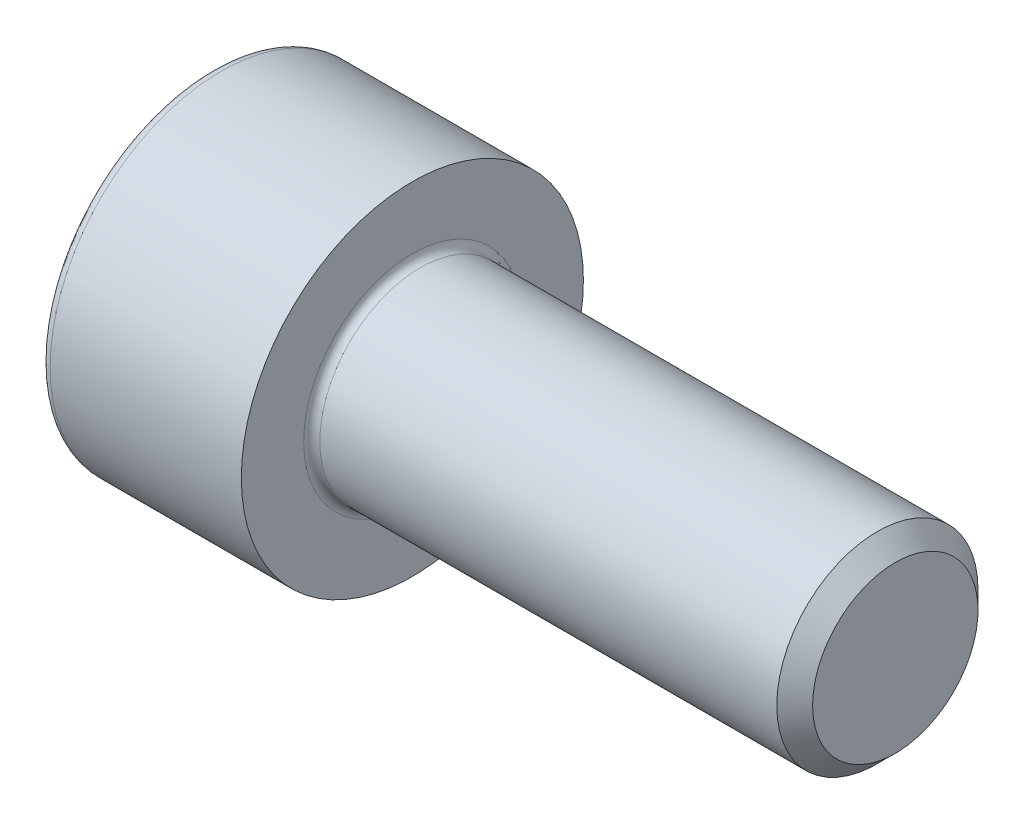
ISO-10303-21;
HEADER;
FILE_DESCRIPTION(('STEP AP214'),'2;1');
FILE_NAME('part.step','',(''),(''),'','','');
FILE_SCHEMA(('AUTOMOTIVE_DESIGN { 1 0 10303 214 1 1 1 1 }'));
ENDSEC;
DATA;
#1=APPLICATION_CONTEXT('core data for automotive mechanical design processes');
#2=APPLICATION_PROTOCOL_DEFINITION('international standard','automotive_design',2000,#1);
#3=PRODUCT_CONTEXT('',#1,'mechanical');
#4=PRODUCT('Part','Part','',(#3));
#5=PRODUCT_RELATED_PRODUCT_CATEGORY('part','',(#4));
#6=PRODUCT_DEFINITION_FORMATION('','',#4);
#7=PRODUCT_DEFINITION_CONTEXT('part definition',#1,'design');
#8=PRODUCT_DEFINITION('design','',#6,#7);
#9=PRODUCT_DEFINITION_SHAPE('','',#8);
#10=(LENGTH_UNIT() NAMED_UNIT(*) SI_UNIT(.MILLI.,.METRE.));
#11=(NAMED_UNIT(*) PLANE_ANGLE_UNIT() SI_UNIT($,.RADIAN.));
#12=(NAMED_UNIT(*) SI_UNIT($,.STERADIAN.) SOLID_ANGLE_UNIT());
#13=UNCERTAINTY_MEASURE_WITH_UNIT(LENGTH_MEASURE(1.E-05),#10,'distance_accuracy_value','');
#14=(GEOMETRIC_REPRESENTATION_CONTEXT(3) GLOBAL_UNCERTAINTY_ASSIGNED_CONTEXT((#13)) GLOBAL_UNIT_ASSIGNED_CONTEXT((#10,
#11,#12)) REPRESENTATION_CONTEXT('',''));
#15=CARTESIAN_POINT('',(0.,0.,0.));
#16=DIRECTION('',(0.,0.,1.));
#17=DIRECTION('',(1.,0.,0.));
#18=AXIS2_PLACEMENT_3D('',#15,#16,#17);
#19=CARTESIAN_POINT('',(2.5,2.3094010767585,0.));
#20=DIRECTION('',(1.,0.,0.));
#21=DIRECTION('',(0.,0.,-1.));
#22=AXIS2_PLACEMENT_3D('',#19,#20,#21);
#23=PLANE('',#22);
#24=CARTESIAN_POINT('',(2.5,0.,0.));
#25=DIRECTION('',(1.,0.,0.));
#26=DIRECTION('',(0.,0.,-1.));
#27=AXIS2_PLACEMENT_3D('',#24,#25,#26);
#28=CIRCLE('',#27,2.);
#29=CARTESIAN_POINT('',(2.5,0.,-2.));
#30=VERTEX_POINT('',#29);
#31=CARTESIAN_POINT('',(2.5,-1.73205080756888,-0.999999999999999));
#32=VERTEX_POINT('',#31);
#33=EDGE_CURVE('E11',#30,#32,#28,.F.);
#34=ORIENTED_EDGE('',*,*,#33,.F.);
#35=DIRECTION('',(0.,1.,0.));
#36=VECTOR('',#35,1.);
#37=CARTESIAN_POINT('',(2.5,-1.15470053837925,-2.));
#38=LINE('',#37,#36);
#39=CARTESIAN_POINT('',(2.5,-1.15470053837925,-2.));
#40=VERTEX_POINT('',#39);
#41=EDGE_CURVE('E178',#40,#30,#38,.T.);
#42=ORIENTED_EDGE('',*,*,#41,.F.);
#43=DIRECTION('',(0.,0.5,-0.866025403784439));
#44=VECTOR('',#43,1.);
#45=CARTESIAN_POINT('',(2.5,-2.3094010767585,0.));
#46=LINE('',#45,#44);
#47=EDGE_CURVE('E174',#32,#40,#46,.T.);
#48=ORIENTED_EDGE('',*,*,#47,.F.);
#49=EDGE_LOOP('',(#34,#42,#48));
#50=FACE_BOUND('',#49,.T.);
#51=ADVANCED_FACE('F34',(#50),#23,.F.);
#52=CARTESIAN_POINT('',(2.5,-1.73205080756888,1.));
#53=VERTEX_POINT('',#52);
#54=EDGE_CURVE('E43',#32,#53,#28,.F.);
#55=ORIENTED_EDGE('',*,*,#54,.F.);
#56=CARTESIAN_POINT('',(2.5,-2.3094010767585,0.));
#57=VERTEX_POINT('',#56);
#58=EDGE_CURVE('E175',#57,#32,#46,.T.);
#59=ORIENTED_EDGE('',*,*,#58,.F.);
#60=DIRECTION('',(0.,-0.5,-0.866025403784439));
#61=VECTOR('',#60,1.);
#62=CARTESIAN_POINT('',(2.5,-1.15470053837925,2.));
#63=LINE('',#62,#61);
#64=EDGE_CURVE('E170',#53,#57,#63,.T.);
#65=ORIENTED_EDGE('',*,*,#64,.F.);
#66=EDGE_LOOP('',(#55,#59,#65));
#67=FACE_BOUND('',#66,.T.);
#68=ADVANCED_FACE('F118',(#67),#23,.F.);
#69=CARTESIAN_POINT('',(2.5,0.,2.));
#70=VERTEX_POINT('',#69);
#71=EDGE_CURVE('E254',#53,#70,#28,.F.);
#72=ORIENTED_EDGE('',*,*,#71,.F.);
#73=CARTESIAN_POINT('',(2.5,-1.15470053837925,2.));
#74=VERTEX_POINT('',#73);
#75=EDGE_CURVE('E171',#74,#53,#63,.T.);
#76=ORIENTED_EDGE('',*,*,#75,.F.);
#77=DIRECTION('',(0.,-1.,0.));
#78=VECTOR('',#77,1.);
#79=CARTESIAN_POINT('',(2.5,1.15470053837925,2.));
#80=LINE('',#79,#78);
#81=EDGE_CURVE('E166',#70,#74,#80,.T.);
#82=ORIENTED_EDGE('',*,*,#81,.F.);
#83=EDGE_LOOP('',(#72,#76,#82));
#84=FACE_BOUND('',#83,.T.);
#85=ADVANCED_FACE('F124',(#84),#23,.F.);
#86=CARTESIAN_POINT('',(2.5,0.,0.));
#87=DIRECTION('',(-1.,0.,0.));
#88=DIRECTION('',(0.,0.,1.));
#89=AXIS2_PLACEMENT_3D('',#86,#87,#88);
#90=CIRCLE('',#89,2.);
#91=CARTESIAN_POINT('',(2.5,1.73205080756888,1.));
#92=VERTEX_POINT('',#91);
#93=EDGE_CURVE('E164',#70,#92,#90,.T.);
#94=ORIENTED_EDGE('',*,*,#93,.F.);
#95=CARTESIAN_POINT('',(2.5,1.15470053837925,2.));
#96=VERTEX_POINT('',#95);
#97=EDGE_CURVE('E167',#96,#70,#80,.T.);
#98=ORIENTED_EDGE('',*,*,#97,.F.);
#99=DIRECTION('',(0.,-0.5,0.866025403784439));
#100=VECTOR('',#99,1.);
#101=CARTESIAN_POINT('',(2.5,2.3094010767585,0.));
#102=LINE('',#101,#100);
#103=EDGE_CURVE('E161',#92,#96,#102,.T.);
#104=ORIENTED_EDGE('',*,*,#103,.F.);
#105=EDGE_LOOP('',(#94,#98,#104));
#106=FACE_BOUND('',#105,.T.);
#107=ADVANCED_FACE('F138',(#106),#23,.F.);
#108=CARTESIAN_POINT('',(2.5,1.73205080756888,-1.));
#109=VERTEX_POINT('',#108);
#110=EDGE_CURVE('E50',#92,#109,#28,.F.);
#111=ORIENTED_EDGE('',*,*,#110,.F.);
#112=CARTESIAN_POINT('',(2.5,2.3094010767585,0.));
#113=VERTEX_POINT('',#112);
#114=EDGE_CURVE('E152',#113,#92,#102,.T.);
#115=ORIENTED_EDGE('',*,*,#114,.F.);
#116=DIRECTION('',(0.,0.5,0.866025403784439));
#117=VECTOR('',#116,1.);
#118=CARTESIAN_POINT('',(2.5,1.15470053837925,-2.));
#119=LINE('',#118,#117);
#120=EDGE_CURVE('E149',#109,#113,#119,.T.);
#121=ORIENTED_EDGE('',*,*,#120,.F.);
#122=EDGE_LOOP('',(#111,#115,#121));
#123=FACE_BOUND('',#122,.T.);
#124=ADVANCED_FACE('F129',(#123),#23,.F.);
#125=EDGE_CURVE('E38',#109,#30,#28,.F.);
#126=ORIENTED_EDGE('',*,*,#125,.F.);
#127=CARTESIAN_POINT('',(2.5,1.15470053837925,-2.));
#128=VERTEX_POINT('',#127);
#129=EDGE_CURVE('E144',#128,#109,#119,.T.);
#130=ORIENTED_EDGE('',*,*,#129,.F.);
#131=EDGE_CURVE('E145',#30,#128,#38,.T.);
#132=ORIENTED_EDGE('',*,*,#131,.F.);
#133=EDGE_LOOP('',(#126,#130,#132));
#134=FACE_BOUND('',#133,.T.);
#135=ADVANCED_FACE('F120',(#134),#23,.F.);
#136=CARTESIAN_POINT('',(0.,0.,0.));
#137=DIRECTION('',(1.,0.,0.));
#138=DIRECTION('',(0.,0.,-1.));
#139=AXIS2_PLACEMENT_3D('',#136,#137,#138);
#140=PLANE('',#139);
#141=CARTESIAN_POINT('',(0.,0.,0.));
#142=DIRECTION('',(1.,0.,0.));
#143=DIRECTION('',(0.,0.,-1.));
#144=AXIS2_PLACEMENT_3D('',#141,#142,#143);
#145=CIRCLE('',#144,4.);
#146=CARTESIAN_POINT('',(0.,0.,-4.));
#147=VERTEX_POINT('',#146);
#148=EDGE_CURVE('E221',#147,#147,#145,.F.);
#149=ORIENTED_EDGE('',*,*,#148,.T.);
#150=EDGE_LOOP('',(#149));
#151=FACE_BOUND('',#150,.T.);
#152=DIRECTION('',(0.,0.5,0.866025403784439));
#153=VECTOR('',#152,1.);
#154=CARTESIAN_POINT('',(0.,1.15470053837925,-2.));
#155=LINE('',#154,#153);
#156=CARTESIAN_POINT('',(0.,1.15470053837925,-2.));
#157=VERTEX_POINT('',#156);
#158=CARTESIAN_POINT('',(0.,2.3094010767585,0.));
#159=VERTEX_POINT('',#158);
#160=EDGE_CURVE('E180',#157,#159,#155,.T.);
#161=ORIENTED_EDGE('',*,*,#160,.T.);
#162=DIRECTION('',(0.,-0.5,0.866025403784439));
#163=VECTOR('',#162,1.);
#164=CARTESIAN_POINT('',(0.,2.3094010767585,0.));
#165=LINE('',#164,#163);
#166=CARTESIAN_POINT('',(0.,1.15470053837925,2.));
#167=VERTEX_POINT('',#166);
#168=EDGE_CURVE('E182',#159,#167,#165,.T.);
#169=ORIENTED_EDGE('',*,*,#168,.T.);
#170=DIRECTION('',(0.,-1.,0.));
#171=VECTOR('',#170,1.);
#172=CARTESIAN_POINT('',(0.,1.15470053837925,2.));
#173=LINE('',#172,#171);
#174=CARTESIAN_POINT('',(0.,-1.15470053837925,2.));
#175=VERTEX_POINT('',#174);
#176=EDGE_CURVE('E184',#167,#175,#173,.T.);
#177=ORIENTED_EDGE('',*,*,#176,.T.);
#178=DIRECTION('',(0.,-0.5,-0.866025403784439));
#179=VECTOR('',#178,1.);
#180=CARTESIAN_POINT('',(0.,-1.15470053837925,2.));
#181=LINE('',#180,#179);
#182=CARTESIAN_POINT('',(0.,-2.3094010767585,0.));
#183=VERTEX_POINT('',#182);
#184=EDGE_CURVE('E186',#175,#183,#181,.T.);
#185=ORIENTED_EDGE('',*,*,#184,.T.);
#186=DIRECTION('',(0.,0.5,-0.866025403784439));
#187=VECTOR('',#186,1.);
#188=CARTESIAN_POINT('',(0.,-2.3094010767585,0.));
#189=LINE('',#188,#187);
#190=CARTESIAN_POINT('',(0.,-1.15470053837925,-2.));
#191=VERTEX_POINT('',#190);
#192=EDGE_CURVE('E188',#183,#191,#189,.T.);
#193=ORIENTED_EDGE('',*,*,#192,.T.);
#194=DIRECTION('',(0.,1.,0.));
#195=VECTOR('',#194,1.);
#196=CARTESIAN_POINT('',(0.,-1.15470053837925,-2.));
#197=LINE('',#196,#195);
#198=EDGE_CURVE('E58',#191,#157,#197,.T.);
#199=ORIENTED_EDGE('',*,*,#198,.T.);
#200=EDGE_LOOP('',(#161,#169,#177,#185,#193,#199));
#201=FACE_BOUND('',#200,.T.);
#202=ADVANCED_FACE('F128',(#151,#201),#140,.F.);
#203=CARTESIAN_POINT('',(0.,0.,0.));
#204=DIRECTION('',(-1.,0.,0.));
#205=DIRECTION('',(0.,0.,1.));
#206=AXIS2_PLACEMENT_3D('',#203,#204,#205);
#207=CYLINDRICAL_SURFACE('',#206,4.25);
#208=CARTESIAN_POINT('',(0.25,0.,0.));
#209=DIRECTION('',(1.,0.,0.));
#210=DIRECTION('',(0.,0.,-1.));
#211=AXIS2_PLACEMENT_3D('',#208,#209,#210);
#212=CIRCLE('',#211,4.25);
#213=CARTESIAN_POINT('',(0.25,0.,-4.25));
#214=VERTEX_POINT('',#213);
#215=EDGE_CURVE('E147',#214,#214,#212,.T.);
#216=ORIENTED_EDGE('',*,*,#215,.T.);
#217=EDGE_LOOP('',(#216));
#218=FACE_BOUND('',#217,.T.);
#219=CARTESIAN_POINT('',(5.,0.,0.));
#220=DIRECTION('',(-1.,0.,0.));
#221=DIRECTION('',(0.,0.,1.));
#222=AXIS2_PLACEMENT_3D('',#219,#220,#221);
#223=CIRCLE('',#222,4.25);
#224=CARTESIAN_POINT('',(5.,0.,4.25));
#225=VERTEX_POINT('',#224);
#226=EDGE_CURVE('E212',#225,#225,#223,.T.);
#227=ORIENTED_EDGE('',*,*,#226,.T.);
#228=EDGE_LOOP('',(#227));
#229=FACE_BOUND('',#228,.T.);
#230=ADVANCED_FACE('F135',(#218,#229),#207,.T.);
#231=CARTESIAN_POINT('',(5.,4.25,0.));
#232=DIRECTION('',(-1.,0.,0.));
#233=DIRECTION('',(0.,0.,1.));
#234=AXIS2_PLACEMENT_3D('',#231,#232,#233);
#235=PLANE('',#234);
#236=CARTESIAN_POINT('',(5.,0.,0.));
#237=DIRECTION('',(-1.,0.,0.));
#238=DIRECTION('',(0.,0.,1.));
#239=AXIS2_PLACEMENT_3D('',#236,#237,#238);
#240=CIRCLE('',#239,2.7);
#241=CARTESIAN_POINT('',(5.,0.,2.7));
#242=VERTEX_POINT('',#241);
#243=EDGE_CURVE('E215',#242,#242,#240,.T.);
#244=ORIENTED_EDGE('',*,*,#243,.T.);
#245=EDGE_LOOP('',(#244));
#246=FACE_BOUND('',#245,.T.);
#247=ORIENTED_EDGE('',*,*,#226,.F.);
#248=EDGE_LOOP('',(#247));
#249=FACE_BOUND('',#248,.T.);
#250=ADVANCED_FACE('F363',(#246,#249),#235,.F.);
#251=CARTESIAN_POINT('',(0.,0.,0.));
#252=DIRECTION('',(-1.,0.,0.));
#253=DIRECTION('',(0.,0.,1.));
#254=AXIS2_PLACEMENT_3D('',#251,#252,#253);
#255=CYLINDRICAL_SURFACE('',#254,2.5);
#256=CARTESIAN_POINT('',(5.2,0.,0.));
#257=DIRECTION('',(-1.,0.,0.));
#258=DIRECTION('',(0.,0.,1.));
#259=AXIS2_PLACEMENT_3D('',#256,#257,#258);
#260=CIRCLE('',#259,2.5);
#261=CARTESIAN_POINT('',(5.2,0.,2.5));
#262=VERTEX_POINT('',#261);
#263=EDGE_CURVE('E218',#262,#262,#260,.F.);
#264=ORIENTED_EDGE('',*,*,#263,.T.);
#265=EDGE_LOOP('',(#264));
#266=FACE_BOUND('',#265,.T.);
#267=CARTESIAN_POINT('',(16.555,0.,0.));
#268=DIRECTION('',(-1.,0.,0.));
#269=DIRECTION('',(0.,0.,1.));
#270=AXIS2_PLACEMENT_3D('',#267,#268,#269);
#271=CIRCLE('',#270,2.5);
#272=CARTESIAN_POINT('',(16.555,0.,2.5));
#273=VERTEX_POINT('',#272);
#274=EDGE_CURVE('E209',#273,#273,#271,.T.);
#275=ORIENTED_EDGE('',*,*,#274,.T.);
#276=EDGE_LOOP('',(#275));
#277=FACE_BOUND('',#276,.T.);
#278=ADVANCED_FACE('F379',(#266,#277),#255,.T.);
#279=CARTESIAN_POINT('',(17.,0.,0.));
#280=DIRECTION('',(-1.,0.,0.));
#281=DIRECTION('',(0.,0.,1.));
#282=AXIS2_PLACEMENT_3D('',#279,#280,#281);
#283=CONICAL_SURFACE('',#282,2.055,0.785398163397451);
#284=ORIENTED_EDGE('',*,*,#274,.F.);
#285=EDGE_LOOP('',(#284));
#286=FACE_BOUND('',#285,.T.);
#287=CARTESIAN_POINT('',(17.,0.,0.));
#288=DIRECTION('',(-1.,0.,0.));
#289=DIRECTION('',(0.,0.,1.));
#290=AXIS2_PLACEMENT_3D('',#287,#288,#289);
#291=CIRCLE('',#290,2.055);
#292=CARTESIAN_POINT('',(17.,0.,2.055));
#293=VERTEX_POINT('',#292);
#294=EDGE_CURVE('E206',#293,#293,#291,.T.);
#295=ORIENTED_EDGE('',*,*,#294,.T.);
#296=EDGE_LOOP('',(#295));
#297=FACE_BOUND('',#296,.T.);
#298=ADVANCED_FACE('F385',(#286,#297),#283,.T.);
#299=CARTESIAN_POINT('',(17.,2.055,0.));
#300=DIRECTION('',(-1.,0.,0.));
#301=DIRECTION('',(0.,0.,1.));
#302=AXIS2_PLACEMENT_3D('',#299,#300,#301);
#303=PLANE('',#302);
#304=ORIENTED_EDGE('',*,*,#294,.F.);
#305=EDGE_LOOP('',(#304));
#306=FACE_BOUND('',#305,.T.);
#307=ADVANCED_FACE('F372',(#306),#303,.F.);
#308=CARTESIAN_POINT('',(5.2,0.,0.));
#309=DIRECTION('',(-1.,0.,0.));
#310=DIRECTION('',(0.,0.,1.));
#311=AXIS2_PLACEMENT_3D('',#308,#309,#310);
#312=TOROIDAL_SURFACE('',#311,2.7,0.2);
#313=ORIENTED_EDGE('',*,*,#263,.F.);
#314=EDGE_LOOP('',(#313));
#315=FACE_BOUND('',#314,.T.);
#316=ORIENTED_EDGE('',*,*,#243,.F.);
#317=EDGE_LOOP('',(#316));
#318=FACE_BOUND('',#317,.T.);
#319=ADVANCED_FACE('F230',(#315,#318),#312,.F.);
#320=CARTESIAN_POINT('',(0.25,0.,0.));
#321=DIRECTION('',(1.,0.,0.));
#322=DIRECTION('',(0.,0.,-1.));
#323=AXIS2_PLACEMENT_3D('',#320,#321,#322);
#324=TOROIDAL_SURFACE('',#323,4.,0.25);
#325=ORIENTED_EDGE('',*,*,#215,.F.);
#326=EDGE_LOOP('',(#325));
#327=FACE_BOUND('',#326,.T.);
#328=ORIENTED_EDGE('',*,*,#148,.F.);
#329=EDGE_LOOP('',(#328));
#330=FACE_BOUND('',#329,.T.);
#331=ADVANCED_FACE('F36',(#327,#330),#324,.T.);
#332=CARTESIAN_POINT('',(2.5,1.15470053837925,-2.));
#333=DIRECTION('',(0.,-0.866025403784439,0.5));
#334=DIRECTION('',(0.,-0.5,-0.866025403784439));
#335=AXIS2_PLACEMENT_3D('',#332,#333,#334);
#336=PLANE('',#335);
#337=ORIENTED_EDGE('',*,*,#129,.T.);
#338=ORIENTED_EDGE('',*,*,#120,.T.);
#339=DIRECTION('',(-1.,0.,0.));
#340=VECTOR('',#339,1.);
#341=CARTESIAN_POINT('',(2.5,2.3094010767585,0.));
#342=LINE('',#341,#340);
#343=EDGE_CURVE('E204',#113,#159,#342,.T.);
#344=ORIENTED_EDGE('',*,*,#343,.T.);
#345=ORIENTED_EDGE('',*,*,#160,.F.);
#346=DIRECTION('',(-1.,0.,0.));
#347=VECTOR('',#346,1.);
#348=CARTESIAN_POINT('',(2.5,1.15470053837925,-2.));
#349=LINE('',#348,#347);
#350=EDGE_CURVE('E160',#128,#157,#349,.T.);
#351=ORIENTED_EDGE('',*,*,#350,.F.);
#352=EDGE_LOOP('',(#337,#338,#344,#345,#351));
#353=FACE_BOUND('',#352,.T.);
#354=ADVANCED_FACE('F158',(#353),#336,.T.);
#355=CARTESIAN_POINT('',(2.5,2.3094010767585,0.));
#356=DIRECTION('',(0.,-0.866025403784439,-0.5));
#357=DIRECTION('',(0.,0.5,-0.866025403784439));
#358=AXIS2_PLACEMENT_3D('',#355,#356,#357);
#359=PLANE('',#358);
#360=ORIENTED_EDGE('',*,*,#114,.T.);
#361=ORIENTED_EDGE('',*,*,#103,.T.);
#362=DIRECTION('',(-1.,0.,0.));
#363=VECTOR('',#362,1.);
#364=CARTESIAN_POINT('',(2.5,1.15470053837925,2.));
#365=LINE('',#364,#363);
#366=EDGE_CURVE('E201',#96,#167,#365,.T.);
#367=ORIENTED_EDGE('',*,*,#366,.T.);
#368=ORIENTED_EDGE('',*,*,#168,.F.);
#369=ORIENTED_EDGE('',*,*,#343,.F.);
#370=EDGE_LOOP('',(#360,#361,#367,#368,#369));
#371=FACE_BOUND('',#370,.T.);
#372=ADVANCED_FACE('F234',(#371),#359,.T.);
#373=CARTESIAN_POINT('',(2.5,1.15470053837925,2.));
#374=DIRECTION('',(0.,0.,-1.));
#375=DIRECTION('',(-1.,0.,0.));
#376=AXIS2_PLACEMENT_3D('',#373,#374,#375);
#377=PLANE('',#376);
#378=ORIENTED_EDGE('',*,*,#97,.T.);
#379=ORIENTED_EDGE('',*,*,#81,.T.);
#380=DIRECTION('',(-1.,0.,0.));
#381=VECTOR('',#380,1.);
#382=CARTESIAN_POINT('',(2.5,-1.15470053837925,2.));
#383=LINE('',#382,#381);
#384=EDGE_CURVE('E198',#74,#175,#383,.T.);
#385=ORIENTED_EDGE('',*,*,#384,.T.);
#386=ORIENTED_EDGE('',*,*,#176,.F.);
#387=ORIENTED_EDGE('',*,*,#366,.F.);
#388=EDGE_LOOP('',(#378,#379,#385,#386,#387));
#389=FACE_BOUND('',#388,.T.);
#390=ADVANCED_FACE('F239',(#389),#377,.T.);
#391=CARTESIAN_POINT('',(2.5,-1.15470053837925,2.));
#392=DIRECTION('',(0.,0.866025403784439,-0.5));
#393=DIRECTION('',(0.,0.5,0.866025403784439));
#394=AXIS2_PLACEMENT_3D('',#391,#392,#393);
#395=PLANE('',#394);
#396=ORIENTED_EDGE('',*,*,#75,.T.);
#397=ORIENTED_EDGE('',*,*,#64,.T.);
#398=DIRECTION('',(-1.,0.,0.));
#399=VECTOR('',#398,1.);
#400=CARTESIAN_POINT('',(2.5,-2.3094010767585,0.));
#401=LINE('',#400,#399);
#402=EDGE_CURVE('E195',#57,#183,#401,.T.);
#403=ORIENTED_EDGE('',*,*,#402,.T.);
#404=ORIENTED_EDGE('',*,*,#184,.F.);
#405=ORIENTED_EDGE('',*,*,#384,.F.);
#406=EDGE_LOOP('',(#396,#397,#403,#404,#405));
#407=FACE_BOUND('',#406,.T.);
#408=ADVANCED_FACE('F245',(#407),#395,.T.);
#409=CARTESIAN_POINT('',(2.5,-2.3094010767585,0.));
#410=DIRECTION('',(0.,0.866025403784439,0.5));
#411=DIRECTION('',(0.,-0.5,0.866025403784439));
#412=AXIS2_PLACEMENT_3D('',#409,#410,#411);
#413=PLANE('',#412);
#414=ORIENTED_EDGE('',*,*,#58,.T.);
#415=ORIENTED_EDGE('',*,*,#47,.T.);
#416=DIRECTION('',(-1.,0.,0.));
#417=VECTOR('',#416,1.);
#418=CARTESIAN_POINT('',(2.5,-1.15470053837925,-2.));
#419=LINE('',#418,#417);
#420=EDGE_CURVE('E192',#40,#191,#419,.T.);
#421=ORIENTED_EDGE('',*,*,#420,.T.);
#422=ORIENTED_EDGE('',*,*,#192,.F.);
#423=ORIENTED_EDGE('',*,*,#402,.F.);
#424=EDGE_LOOP('',(#414,#415,#421,#422,#423));
#425=FACE_BOUND('',#424,.T.);
#426=ADVANCED_FACE('F113',(#425),#413,.T.);
#427=CARTESIAN_POINT('',(2.5,-1.15470053837925,-2.));
#428=DIRECTION('',(0.,0.,1.));
#429=DIRECTION('',(1.,0.,0.));
#430=AXIS2_PLACEMENT_3D('',#427,#428,#429);
#431=PLANE('',#430);
#432=ORIENTED_EDGE('',*,*,#41,.T.);
#433=ORIENTED_EDGE('',*,*,#131,.T.);
#434=ORIENTED_EDGE('',*,*,#350,.T.);
#435=ORIENTED_EDGE('',*,*,#198,.F.);
#436=ORIENTED_EDGE('',*,*,#420,.F.);
#437=EDGE_LOOP('',(#432,#433,#434,#435,#436));
#438=FACE_BOUND('',#437,.T.);
#439=ADVANCED_FACE('F108',(#438),#431,.T.);
#440=CARTESIAN_POINT('',(3.65470053837927,0.,0.));
#441=DIRECTION('',(-1.,0.,0.));
#442=DIRECTION('',(0.,0.,1.));
#443=AXIS2_PLACEMENT_3D('',#440,#441,#442);
#444=CONICAL_SURFACE('',#443,0.,1.04719755119659);
#445=ORIENTED_EDGE('',*,*,#93,.T.);
#446=ORIENTED_EDGE('',*,*,#110,.T.);
#447=ORIENTED_EDGE('',*,*,#125,.T.);
#448=ORIENTED_EDGE('',*,*,#33,.T.);
#449=ORIENTED_EDGE('',*,*,#54,.T.);
#450=ORIENTED_EDGE('',*,*,#71,.T.);
#451=EDGE_LOOP('',(#445,#446,#447,#448,#449,#450));
#452=FACE_BOUND('',#451,.T.);
#453=CARTESIAN_POINT('',(3.65470053837927,0.,0.));
#454=VERTEX_POINT('',#453);
#455=VERTEX_LOOP('',#454);
#456=FACE_BOUND('',#455,.T.);
#457=ADVANCED_FACE('F106',(#452,#456),#444,.F.);
#458=CLOSED_SHELL('',(#51,#68,#85,#107,#124,#135,#202,#230,#250,#278,#298,#307,#319,#331,#354,
#372,#390,#408,#426,#439,#457));
#459=MANIFOLD_SOLID_BREP('B2',#458);
#460=ADVANCED_BREP_SHAPE_REPRESENTATION('',(#18,#459),#14);
#461=SHAPE_DEFINITION_REPRESENTATION(#9,#460);
ENDSEC;
END-ISO-10303-21;
